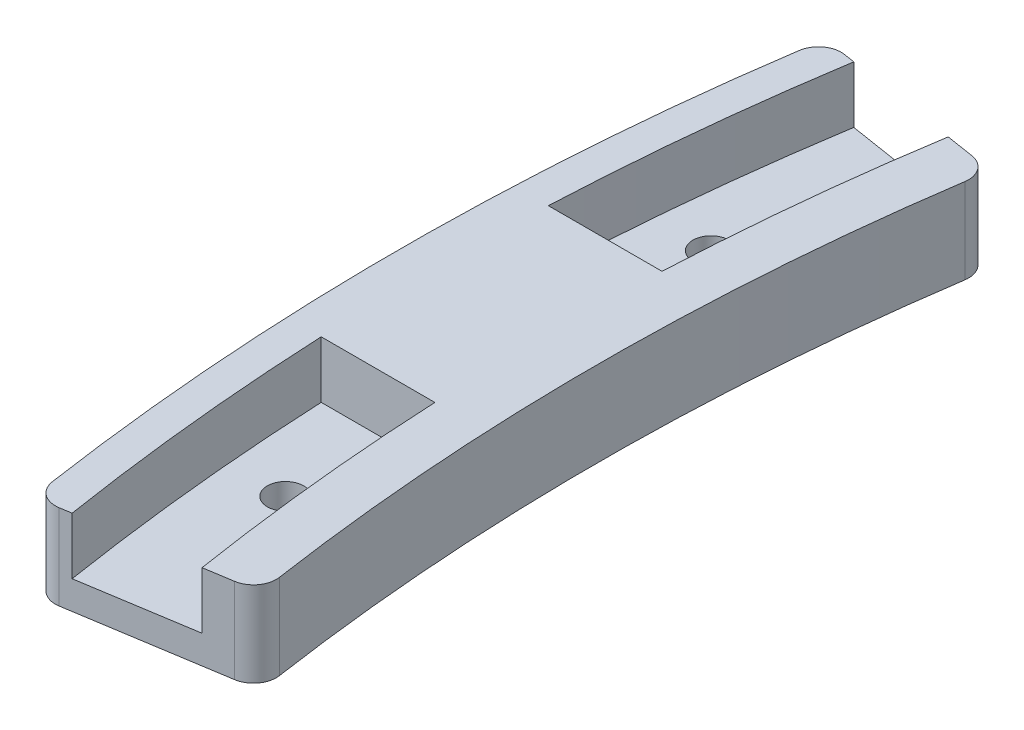
ISO-10303-21;
HEADER;
FILE_DESCRIPTION(('STEP AP214'),'2;1');
FILE_NAME('part.step','',(''),(''),'','','');
FILE_SCHEMA(('AUTOMOTIVE_DESIGN { 1 0 10303 214 1 1 1 1 }'));
ENDSEC;
DATA;
#1=APPLICATION_CONTEXT('core data for automotive mechanical design processes');
#2=APPLICATION_PROTOCOL_DEFINITION('international standard','automotive_design',2000,#1);
#3=PRODUCT_CONTEXT('',#1,'mechanical');
#4=PRODUCT('Part','Part','',(#3));
#5=PRODUCT_RELATED_PRODUCT_CATEGORY('part','',(#4));
#6=PRODUCT_DEFINITION_FORMATION('','',#4);
#7=PRODUCT_DEFINITION_CONTEXT('part definition',#1,'design');
#8=PRODUCT_DEFINITION('design','',#6,#7);
#9=PRODUCT_DEFINITION_SHAPE('','',#8);
#10=(LENGTH_UNIT() NAMED_UNIT(*) SI_UNIT(.MILLI.,.METRE.));
#11=(NAMED_UNIT(*) PLANE_ANGLE_UNIT() SI_UNIT($,.RADIAN.));
#12=(NAMED_UNIT(*) SI_UNIT($,.STERADIAN.) SOLID_ANGLE_UNIT());
#13=UNCERTAINTY_MEASURE_WITH_UNIT(LENGTH_MEASURE(1.E-05),#10,'distance_accuracy_value','');
#14=(GEOMETRIC_REPRESENTATION_CONTEXT(3) GLOBAL_UNCERTAINTY_ASSIGNED_CONTEXT((#13)) GLOBAL_UNIT_ASSIGNED_CONTEXT((#10,
#11,#12)) REPRESENTATION_CONTEXT('',''));
#15=CARTESIAN_POINT('',(0.,0.,0.));
#16=DIRECTION('',(0.,0.,1.));
#17=DIRECTION('',(1.,0.,0.));
#18=AXIS2_PLACEMENT_3D('',#15,#16,#17);
#19=CARTESIAN_POINT('',(0.,10.,0.));
#20=DIRECTION('',(0.156434465040234,0.,0.987688340595137));
#21=DIRECTION('',(0.987688340595137,0.,-0.156434465040234));
#22=AXIS2_PLACEMENT_3D('',#19,#20,#21);
#23=PLANE('',#22);
#24=DIRECTION('',(0.,1.,0.));
#25=VECTOR('',#24,1.);
#26=CARTESIAN_POINT('',(-218.270184732485,0.,34.5706010483885));
#27=LINE('',#26,#25);
#28=CARTESIAN_POINT('',(-218.270184732485,10.,34.5706010483885));
#29=VERTEX_POINT('',#28);
#30=CARTESIAN_POINT('',(-218.270184732485,2.5,34.5706010483885));
#31=VERTEX_POINT('',#30);
#32=EDGE_CURVE('E11',#29,#31,#27,.F.);
#33=ORIENTED_EDGE('',*,*,#32,.T.);
#34=DIRECTION('',(-0.987688340595137,0.,0.156434465040233));
#35=VECTOR('',#34,1.);
#36=CARTESIAN_POINT('',(-204.935810564757,2.5,32.4586436587549));
#37=LINE('',#36,#35);
#38=CARTESIAN_POINT('',(-204.935810564757,2.5,32.4586436587549));
#39=VERTEX_POINT('',#38);
#40=EDGE_CURVE('E155',#39,#31,#37,.T.);
#41=ORIENTED_EDGE('',*,*,#40,.F.);
#42=DIRECTION('',(0.,-1.,0.));
#43=VECTOR('',#42,1.);
#44=CARTESIAN_POINT('',(-204.935810564757,10.,32.4586436587549));
#45=LINE('',#44,#43);
#46=CARTESIAN_POINT('',(-204.935810564757,10.,32.4586436587549));
#47=VERTEX_POINT('',#46);
#48=EDGE_CURVE('E43',#39,#47,#45,.F.);
#49=ORIENTED_EDGE('',*,*,#48,.T.);
#50=DIRECTION('',(-0.987688340595137,0.,0.156434465040234));
#51=VECTOR('',#50,1.);
#52=CARTESIAN_POINT('',(0.,10.,0.));
#53=LINE('',#52,#51);
#54=CARTESIAN_POINT('',(-207.414551524979,10.,32.8512376584491));
#55=VERTEX_POINT('',#54);
#56=EDGE_CURVE('E200',#47,#55,#53,.T.);
#57=ORIENTED_EDGE('',*,*,#56,.T.);
#58=DIRECTION('',(0.,1.,0.));
#59=VECTOR('',#58,1.);
#60=CARTESIAN_POINT('',(-207.414551524979,5.,32.8512376584491));
#61=LINE('',#60,#59);
#62=CARTESIAN_POINT('',(-207.414551524979,5.,32.8512376584491));
#63=VERTEX_POINT('',#62);
#64=EDGE_CURVE('E288',#63,#55,#61,.T.);
#65=ORIENTED_EDGE('',*,*,#64,.F.);
#66=DIRECTION('',(0.987688340595137,0.,-0.156434465040234));
#67=VECTOR('',#66,1.);
#68=CARTESIAN_POINT('',(0.,5.,0.));
#69=LINE('',#68,#67);
#70=CARTESIAN_POINT('',(-217.29143493093,5.,34.4155823088514));
#71=VERTEX_POINT('',#70);
#72=EDGE_CURVE('E279',#71,#63,#69,.T.);
#73=ORIENTED_EDGE('',*,*,#72,.F.);
#74=DIRECTION('',(0.,1.,0.));
#75=VECTOR('',#74,1.);
#76=CARTESIAN_POINT('',(-217.29143493093,5.,34.4155823088514));
#77=LINE('',#76,#75);
#78=CARTESIAN_POINT('',(-217.29143493093,10.,34.4155823088514));
#79=VERTEX_POINT('',#78);
#80=EDGE_CURVE('E290',#71,#79,#77,.T.);
#81=ORIENTED_EDGE('',*,*,#80,.T.);
#82=EDGE_CURVE('E210',#79,#29,#53,.T.);
#83=ORIENTED_EDGE('',*,*,#82,.T.);
#84=EDGE_LOOP('',(#33,#41,#49,#57,#65,#73,#81,#83));
#85=FACE_BOUND('',#84,.T.);
#86=ADVANCED_FACE('F35',(#85),#23,.T.);
#87=CARTESIAN_POINT('',(0.,10.,0.));
#88=DIRECTION('',(0.156434465040234,0.,-0.987688340595137));
#89=DIRECTION('',(-0.987688340595137,0.,-0.156434465040234));
#90=AXIS2_PLACEMENT_3D('',#87,#88,#89);
#91=PLANE('',#90);
#92=DIRECTION('',(0.,-1.,0.));
#93=VECTOR('',#92,1.);
#94=CARTESIAN_POINT('',(-204.935810564757,10.,-32.4586436587549));
#95=LINE('',#94,#93);
#96=CARTESIAN_POINT('',(-204.935810564757,10.,-32.4586436587549));
#97=VERTEX_POINT('',#96);
#98=CARTESIAN_POINT('',(-204.935810564757,2.5,-32.4586436587549));
#99=VERTEX_POINT('',#98);
#100=EDGE_CURVE('E175',#97,#99,#95,.T.);
#101=ORIENTED_EDGE('',*,*,#100,.T.);
#102=DIRECTION('',(0.987688340595137,0.,0.156434465040233));
#103=VECTOR('',#102,1.);
#104=CARTESIAN_POINT('',(-218.270184732485,2.5,-34.5706010483885));
#105=LINE('',#104,#103);
#106=CARTESIAN_POINT('',(-218.270184732485,2.5,-34.5706010483884));
#107=VERTEX_POINT('',#106);
#108=EDGE_CURVE('E500',#107,#99,#105,.T.);
#109=ORIENTED_EDGE('',*,*,#108,.F.);
#110=DIRECTION('',(0.,1.,0.));
#111=VECTOR('',#110,1.);
#112=CARTESIAN_POINT('',(-218.270184732485,10.,-34.5706010483885));
#113=LINE('',#112,#111);
#114=CARTESIAN_POINT('',(-218.270184732485,10.,-34.5706010483885));
#115=VERTEX_POINT('',#114);
#116=EDGE_CURVE('E185',#107,#115,#113,.T.);
#117=ORIENTED_EDGE('',*,*,#116,.T.);
#118=DIRECTION('',(0.987688340595137,0.,0.156434465040234));
#119=VECTOR('',#118,1.);
#120=CARTESIAN_POINT('',(0.,10.,0.));
#121=LINE('',#120,#119);
#122=CARTESIAN_POINT('',(-217.29143493093,10.,-34.4155823088514));
#123=VERTEX_POINT('',#122);
#124=EDGE_CURVE('E177',#115,#123,#121,.T.);
#125=ORIENTED_EDGE('',*,*,#124,.T.);
#126=DIRECTION('',(0.,1.,0.));
#127=VECTOR('',#126,1.);
#128=CARTESIAN_POINT('',(-217.291434930931,5.,-34.4155823088515));
#129=LINE('',#128,#127);
#130=CARTESIAN_POINT('',(-217.291434930931,5.,-34.4155823088515));
#131=VERTEX_POINT('',#130);
#132=EDGE_CURVE('E254',#131,#123,#129,.T.);
#133=ORIENTED_EDGE('',*,*,#132,.F.);
#134=DIRECTION('',(-0.987688340595137,0.,-0.156434465040234));
#135=VECTOR('',#134,1.);
#136=CARTESIAN_POINT('',(0.,5.,0.));
#137=LINE('',#136,#135);
#138=CARTESIAN_POINT('',(-207.414551524979,5.,-32.8512376584492));
#139=VERTEX_POINT('',#138);
#140=EDGE_CURVE('E243',#139,#131,#137,.T.);
#141=ORIENTED_EDGE('',*,*,#140,.F.);
#142=DIRECTION('',(0.,1.,0.));
#143=VECTOR('',#142,1.);
#144=CARTESIAN_POINT('',(-207.414551524979,5.,-32.8512376584492));
#145=LINE('',#144,#143);
#146=CARTESIAN_POINT('',(-207.414551524979,10.,-32.8512376584492));
#147=VERTEX_POINT('',#146);
#148=EDGE_CURVE('E264',#139,#147,#145,.T.);
#149=ORIENTED_EDGE('',*,*,#148,.T.);
#150=EDGE_CURVE('E218',#147,#97,#121,.T.);
#151=ORIENTED_EDGE('',*,*,#150,.T.);
#152=EDGE_LOOP('',(#101,#109,#117,#125,#133,#141,#149,#151));
#153=FACE_BOUND('',#152,.T.);
#154=ADVANCED_FACE('F318',(#153),#91,.T.);
#155=CARTESIAN_POINT('',(0.,10.,0.));
#156=DIRECTION('',(0.,-1.,0.));
#157=DIRECTION('',(0.,0.,-1.));
#158=AXIS2_PLACEMENT_3D('',#155,#156,#157);
#159=CYLINDRICAL_SURFACE('',#158,205.5);
#160=DIRECTION('',(0.,-1.,0.));
#161=VECTOR('',#160,1.);
#162=CARTESIAN_POINT('',(-203.270378969586,10.,30.1894523560941));
#163=LINE('',#162,#161);
#164=CARTESIAN_POINT('',(-203.270378969586,10.,30.1894523560941));
#165=VERTEX_POINT('',#164);
#166=CARTESIAN_POINT('',(-203.270378969586,2.5,30.1894523560941));
#167=VERTEX_POINT('',#166);
#168=EDGE_CURVE('E193',#165,#167,#163,.T.);
#169=ORIENTED_EDGE('',*,*,#168,.T.);
#170=CARTESIAN_POINT('',(0.,2.5,0.));
#171=DIRECTION('',(0.,1.,0.));
#172=DIRECTION('',(0.,0.,-1.));
#173=AXIS2_PLACEMENT_3D('',#170,#171,#172);
#174=CIRCLE('',#173,205.5);
#175=CARTESIAN_POINT('',(-203.270378969586,2.5,-30.1894523560941));
#176=VERTEX_POINT('',#175);
#177=EDGE_CURVE('E50',#176,#167,#174,.T.);
#178=ORIENTED_EDGE('',*,*,#177,.F.);
#179=DIRECTION('',(0.,-1.,0.));
#180=VECTOR('',#179,1.);
#181=CARTESIAN_POINT('',(-203.270378969586,10.,-30.1894523560941));
#182=LINE('',#181,#180);
#183=CARTESIAN_POINT('',(-203.270378969586,10.,-30.1894523560941));
#184=VERTEX_POINT('',#183);
#185=EDGE_CURVE('E196',#176,#184,#182,.F.);
#186=ORIENTED_EDGE('',*,*,#185,.T.);
#187=CARTESIAN_POINT('',(0.,10.,0.));
#188=DIRECTION('',(0.,1.,0.));
#189=DIRECTION('',(0.,0.,1.));
#190=AXIS2_PLACEMENT_3D('',#187,#188,#189);
#191=CIRCLE('',#190,205.5);
#192=EDGE_CURVE('E209',#184,#165,#191,.T.);
#193=ORIENTED_EDGE('',*,*,#192,.T.);
#194=EDGE_LOOP('',(#169,#178,#186,#193));
#195=FACE_BOUND('',#194,.T.);
#196=ADVANCED_FACE('F215',(#195),#159,.F.);
#197=CARTESIAN_POINT('',(0.,10.,0.));
#198=DIRECTION('',(0.,-1.,0.));
#199=DIRECTION('',(0.,0.,-1.));
#200=AXIS2_PLACEMENT_3D('',#197,#198,#199);
#201=CYLINDRICAL_SURFACE('',#200,223.);
#202=CARTESIAN_POINT('',(0.,2.5,0.));
#203=DIRECTION('',(0.,-1.,0.));
#204=DIRECTION('',(0.,0.,-1.));
#205=AXIS2_PLACEMENT_3D('',#202,#203,#204);
#206=CIRCLE('',#205,223.);
#207=CARTESIAN_POINT('',(-220.561180845032,2.5,32.8902037732363));
#208=VERTEX_POINT('',#207);
#209=CARTESIAN_POINT('',(-220.561180845032,2.5,-32.890203773236));
#210=VERTEX_POINT('',#209);
#211=EDGE_CURVE('E152',#208,#210,#206,.T.);
#212=ORIENTED_EDGE('',*,*,#211,.F.);
#213=DIRECTION('',(0.,-1.,0.));
#214=VECTOR('',#213,1.);
#215=CARTESIAN_POINT('',(-220.561180845032,10.,32.8902037732362));
#216=LINE('',#215,#214);
#217=CARTESIAN_POINT('',(-220.561180845032,10.,32.8902037732362));
#218=VERTEX_POINT('',#217);
#219=EDGE_CURVE('E164',#208,#218,#216,.F.);
#220=ORIENTED_EDGE('',*,*,#219,.T.);
#221=CARTESIAN_POINT('',(0.,10.,0.));
#222=DIRECTION('',(0.,1.,0.));
#223=DIRECTION('',(0.,0.,1.));
#224=AXIS2_PLACEMENT_3D('',#221,#222,#223);
#225=CIRCLE('',#224,223.);
#226=CARTESIAN_POINT('',(-220.561180845032,10.,-32.8902037732362));
#227=VERTEX_POINT('',#226);
#228=EDGE_CURVE('E173',#227,#218,#225,.T.);
#229=ORIENTED_EDGE('',*,*,#228,.F.);
#230=DIRECTION('',(0.,-1.,0.));
#231=VECTOR('',#230,1.);
#232=CARTESIAN_POINT('',(-220.561180845032,10.,-32.8902037732362));
#233=LINE('',#232,#231);
#234=EDGE_CURVE('E167',#227,#210,#233,.T.);
#235=ORIENTED_EDGE('',*,*,#234,.T.);
#236=EDGE_LOOP('',(#212,#220,#229,#235));
#237=FACE_BOUND('',#236,.T.);
#238=ADVANCED_FACE('F162',(#237),#201,.T.);
#239=CARTESIAN_POINT('',(-214.181860089725,0.,-18.7384846907465));
#240=DIRECTION('',(0.,-1.,0.));
#241=DIRECTION('',(0.,0.,-1.));
#242=AXIS2_PLACEMENT_3D('',#239,#240,#241);
#243=CYLINDRICAL_SURFACE('',#242,1.59999999999999);
#244=CARTESIAN_POINT('',(-214.181860089725,5.,-18.7384846907465));
#245=DIRECTION('',(0.,1.,0.));
#246=DIRECTION('',(0.,0.,1.));
#247=AXIS2_PLACEMENT_3D('',#244,#245,#246);
#248=CIRCLE('',#247,1.59999999999999);
#249=CARTESIAN_POINT('',(-214.181860089725,5.,-17.1384846907465));
#250=VERTEX_POINT('',#249);
#251=EDGE_CURVE('E223',#250,#250,#248,.T.);
#252=ORIENTED_EDGE('',*,*,#251,.T.);
#253=EDGE_LOOP('',(#252));
#254=FACE_BOUND('',#253,.T.);
#255=CARTESIAN_POINT('',(-214.181860089725,2.5,-18.7384846907465));
#256=DIRECTION('',(0.,-1.,0.));
#257=DIRECTION('',(0.,0.,-1.));
#258=AXIS2_PLACEMENT_3D('',#255,#256,#257);
#259=CIRCLE('',#258,1.59999999999999);
#260=CARTESIAN_POINT('',(-214.181860089725,2.5,-20.3384846907465));
#261=VERTEX_POINT('',#260);
#262=EDGE_CURVE('E231',#261,#261,#259,.F.);
#263=ORIENTED_EDGE('',*,*,#262,.F.);
#264=EDGE_LOOP('',(#263));
#265=FACE_BOUND('',#264,.T.);
#266=ADVANCED_FACE('F347',(#254,#265),#243,.F.);
#267=CARTESIAN_POINT('',(-214.181860089725,0.,18.7384846907466));
#268=DIRECTION('',(0.,-1.,0.));
#269=DIRECTION('',(0.,0.,-1.));
#270=AXIS2_PLACEMENT_3D('',#267,#268,#269);
#271=CYLINDRICAL_SURFACE('',#270,1.59999999999999);
#272=CARTESIAN_POINT('',(-214.181860089725,5.,18.7384846907466));
#273=DIRECTION('',(0.,1.,0.));
#274=DIRECTION('',(0.,0.,1.));
#275=AXIS2_PLACEMENT_3D('',#272,#273,#274);
#276=CIRCLE('',#275,1.59999999999999);
#277=CARTESIAN_POINT('',(-214.181860089725,5.,20.3384846907466));
#278=VERTEX_POINT('',#277);
#279=EDGE_CURVE('E180',#278,#278,#276,.T.);
#280=ORIENTED_EDGE('',*,*,#279,.T.);
#281=EDGE_LOOP('',(#280));
#282=FACE_BOUND('',#281,.T.);
#283=CARTESIAN_POINT('',(-214.181860089725,2.5,18.7384846907466));
#284=DIRECTION('',(0.,-1.,0.));
#285=DIRECTION('',(0.,0.,-1.));
#286=AXIS2_PLACEMENT_3D('',#283,#284,#285);
#287=CIRCLE('',#286,1.59999999999999);
#288=CARTESIAN_POINT('',(-214.181860089725,2.5,17.1384846907466));
#289=VERTEX_POINT('',#288);
#290=EDGE_CURVE('E235',#289,#289,#287,.F.);
#291=ORIENTED_EDGE('',*,*,#290,.F.);
#292=EDGE_LOOP('',(#291));
#293=FACE_BOUND('',#292,.T.);
#294=ADVANCED_FACE('F331',(#282,#293),#271,.F.);
#295=CARTESIAN_POINT('',(-218.583053662566,10.,-32.5952243671982));
#296=DIRECTION('',(0.,-1.,0.));
#297=DIRECTION('',(0.,0.,-1.));
#298=AXIS2_PLACEMENT_3D('',#295,#296,#297);
#299=CYLINDRICAL_SURFACE('',#298,2.);
#300=ORIENTED_EDGE('',*,*,#116,.F.);
#301=CARTESIAN_POINT('',(-218.583053662566,2.5,-32.5952243671982));
#302=DIRECTION('',(0.,-1.,0.));
#303=DIRECTION('',(0.,0.,-1.));
#304=AXIS2_PLACEMENT_3D('',#301,#302,#303);
#305=CIRCLE('',#304,1.99999999999997);
#306=EDGE_CURVE('E168',#210,#107,#305,.T.);
#307=ORIENTED_EDGE('',*,*,#306,.F.);
#308=ORIENTED_EDGE('',*,*,#234,.F.);
#309=CARTESIAN_POINT('',(-218.583053662566,10.,-32.5952243671982));
#310=DIRECTION('',(0.,1.,0.));
#311=DIRECTION('',(0.,0.,1.));
#312=AXIS2_PLACEMENT_3D('',#309,#310,#311);
#313=CIRCLE('',#312,2.);
#314=EDGE_CURVE('E191',#115,#227,#313,.T.);
#315=ORIENTED_EDGE('',*,*,#314,.F.);
#316=EDGE_LOOP('',(#300,#307,#308,#315));
#317=FACE_BOUND('',#316,.T.);
#318=ADVANCED_FACE('F327',(#317),#299,.T.);
#319=CARTESIAN_POINT('',(-205.248679494837,10.,-30.4832669775646));
#320=DIRECTION('',(0.,-1.,0.));
#321=DIRECTION('',(0.,0.,-1.));
#322=AXIS2_PLACEMENT_3D('',#319,#320,#321);
#323=CYLINDRICAL_SURFACE('',#322,2.);
#324=ORIENTED_EDGE('',*,*,#185,.F.);
#325=CARTESIAN_POINT('',(-205.248679494837,2.5,-30.4832669775646));
#326=DIRECTION('',(0.,-1.,0.));
#327=DIRECTION('',(0.,0.,-1.));
#328=AXIS2_PLACEMENT_3D('',#325,#326,#327);
#329=CIRCLE('',#328,2.00000000000001);
#330=EDGE_CURVE('E498',#99,#176,#329,.T.);
#331=ORIENTED_EDGE('',*,*,#330,.F.);
#332=ORIENTED_EDGE('',*,*,#100,.F.);
#333=CARTESIAN_POINT('',(-205.248679494837,10.,-30.4832669775646));
#334=DIRECTION('',(0.,1.,0.));
#335=DIRECTION('',(0.,0.,1.));
#336=AXIS2_PLACEMENT_3D('',#333,#334,#335);
#337=CIRCLE('',#336,2.);
#338=EDGE_CURVE('E189',#184,#97,#337,.T.);
#339=ORIENTED_EDGE('',*,*,#338,.F.);
#340=EDGE_LOOP('',(#324,#331,#332,#339));
#341=FACE_BOUND('',#340,.T.);
#342=ADVANCED_FACE('F330',(#341),#323,.T.);
#343=CARTESIAN_POINT('',(-218.583053662566,10.,32.5952243671982));
#344=DIRECTION('',(0.,-1.,0.));
#345=DIRECTION('',(0.,0.,-1.));
#346=AXIS2_PLACEMENT_3D('',#343,#344,#345);
#347=CYLINDRICAL_SURFACE('',#346,2.);
#348=ORIENTED_EDGE('',*,*,#219,.F.);
#349=CARTESIAN_POINT('',(-218.583053662566,2.5,32.5952243671982));
#350=DIRECTION('',(0.,-1.,0.));
#351=DIRECTION('',(0.,0.,-1.));
#352=AXIS2_PLACEMENT_3D('',#349,#350,#351);
#353=CIRCLE('',#352,1.99999999999998);
#354=EDGE_CURVE('E148',#31,#208,#353,.T.);
#355=ORIENTED_EDGE('',*,*,#354,.F.);
#356=ORIENTED_EDGE('',*,*,#32,.F.);
#357=CARTESIAN_POINT('',(-218.583053662566,10.,32.5952243671982));
#358=DIRECTION('',(0.,1.,0.));
#359=DIRECTION('',(0.,0.,1.));
#360=AXIS2_PLACEMENT_3D('',#357,#358,#359);
#361=CIRCLE('',#360,2.);
#362=EDGE_CURVE('E172',#218,#29,#361,.T.);
#363=ORIENTED_EDGE('',*,*,#362,.F.);
#364=EDGE_LOOP('',(#348,#355,#356,#363));
#365=FACE_BOUND('',#364,.T.);
#366=ADVANCED_FACE('F171',(#365),#347,.T.);
#367=CARTESIAN_POINT('',(-205.248679494837,10.,30.4832669775646));
#368=DIRECTION('',(0.,-1.,0.));
#369=DIRECTION('',(0.,0.,-1.));
#370=AXIS2_PLACEMENT_3D('',#367,#368,#369);
#371=CYLINDRICAL_SURFACE('',#370,2.);
#372=ORIENTED_EDGE('',*,*,#48,.F.);
#373=CARTESIAN_POINT('',(-205.248679494837,2.5,30.4832669775646));
#374=DIRECTION('',(0.,-1.,0.));
#375=DIRECTION('',(0.,0.,-1.));
#376=AXIS2_PLACEMENT_3D('',#373,#374,#375);
#377=CIRCLE('',#376,2.00000000000002);
#378=EDGE_CURVE('E213',#167,#39,#377,.T.);
#379=ORIENTED_EDGE('',*,*,#378,.F.);
#380=ORIENTED_EDGE('',*,*,#168,.F.);
#381=CARTESIAN_POINT('',(-205.248679494837,10.,30.4832669775646));
#382=DIRECTION('',(0.,1.,0.));
#383=DIRECTION('',(0.,0.,1.));
#384=AXIS2_PLACEMENT_3D('',#381,#382,#383);
#385=CIRCLE('',#384,2.);
#386=EDGE_CURVE('E58',#47,#165,#385,.T.);
#387=ORIENTED_EDGE('',*,*,#386,.F.);
#388=EDGE_LOOP('',(#372,#379,#380,#387));
#389=FACE_BOUND('',#388,.T.);
#390=ADVANCED_FACE('F37',(#389),#371,.T.);
#391=CARTESIAN_POINT('',(0.,10.,0.));
#392=DIRECTION('',(0.,1.,0.));
#393=DIRECTION('',(0.,0.,1.));
#394=AXIS2_PLACEMENT_3D('',#391,#392,#393);
#395=PLANE('',#394);
#396=ORIENTED_EDGE('',*,*,#124,.F.);
#397=ORIENTED_EDGE('',*,*,#314,.T.);
#398=ORIENTED_EDGE('',*,*,#228,.T.);
#399=ORIENTED_EDGE('',*,*,#362,.T.);
#400=ORIENTED_EDGE('',*,*,#82,.F.);
#401=CARTESIAN_POINT('',(0.,10.,0.));
#402=DIRECTION('',(0.,1.,0.));
#403=DIRECTION('',(0.,0.,1.));
#404=AXIS2_PLACEMENT_3D('',#401,#402,#403);
#405=CIRCLE('',#404,220.);
#406=CARTESIAN_POINT('',(-219.772609758359,10.,10.));
#407=VERTEX_POINT('',#406);
#408=EDGE_CURVE('E228',#407,#79,#405,.T.);
#409=ORIENTED_EDGE('',*,*,#408,.F.);
#410=DIRECTION('',(-1.,0.,0.));
#411=VECTOR('',#410,1.);
#412=CARTESIAN_POINT('',(0.,10.,10.));
#413=LINE('',#412,#411);
#414=CARTESIAN_POINT('',(-209.76176963403,10.,10.));
#415=VERTEX_POINT('',#414);
#416=EDGE_CURVE('E225',#415,#407,#413,.T.);
#417=ORIENTED_EDGE('',*,*,#416,.F.);
#418=CARTESIAN_POINT('',(0.,10.,0.));
#419=DIRECTION('',(0.,1.,0.));
#420=DIRECTION('',(0.,0.,1.));
#421=AXIS2_PLACEMENT_3D('',#418,#419,#420);
#422=CIRCLE('',#421,210.);
#423=EDGE_CURVE('E208',#415,#55,#422,.T.);
#424=ORIENTED_EDGE('',*,*,#423,.T.);
#425=ORIENTED_EDGE('',*,*,#56,.F.);
#426=ORIENTED_EDGE('',*,*,#386,.T.);
#427=ORIENTED_EDGE('',*,*,#192,.F.);
#428=ORIENTED_EDGE('',*,*,#338,.T.);
#429=ORIENTED_EDGE('',*,*,#150,.F.);
#430=CARTESIAN_POINT('',(0.,10.,0.));
#431=DIRECTION('',(0.,1.,0.));
#432=DIRECTION('',(0.,0.,1.));
#433=AXIS2_PLACEMENT_3D('',#430,#431,#432);
#434=CIRCLE('',#433,210.);
#435=CARTESIAN_POINT('',(-209.76176963403,10.,-9.99999999999997));
#436=VERTEX_POINT('',#435);
#437=EDGE_CURVE('E247',#147,#436,#434,.T.);
#438=ORIENTED_EDGE('',*,*,#437,.T.);
#439=DIRECTION('',(-1.,0.,0.));
#440=VECTOR('',#439,1.);
#441=CARTESIAN_POINT('',(0.,10.,-9.99999999999997));
#442=LINE('',#441,#440);
#443=CARTESIAN_POINT('',(-219.772609758359,10.,-9.99999999999997));
#444=VERTEX_POINT('',#443);
#445=EDGE_CURVE('E258',#436,#444,#442,.T.);
#446=ORIENTED_EDGE('',*,*,#445,.T.);
#447=CARTESIAN_POINT('',(0.,10.,0.));
#448=DIRECTION('',(0.,1.,0.));
#449=DIRECTION('',(0.,0.,1.));
#450=AXIS2_PLACEMENT_3D('',#447,#448,#449);
#451=CIRCLE('',#450,220.);
#452=EDGE_CURVE('E255',#123,#444,#451,.T.);
#453=ORIENTED_EDGE('',*,*,#452,.F.);
#454=EDGE_LOOP('',(#396,#397,#398,#399,#400,#409,#417,#424,#425,#426,#427,#428,#429,#438,#446,#453));
#455=FACE_BOUND('',#454,.T.);
#456=ADVANCED_FACE('F205',(#455),#395,.T.);
#457=CARTESIAN_POINT('',(0.,5.,10.));
#458=DIRECTION('',(0.,0.,-1.));
#459=DIRECTION('',(-1.,0.,0.));
#460=AXIS2_PLACEMENT_3D('',#457,#458,#459);
#461=PLANE('',#460);
#462=ORIENTED_EDGE('',*,*,#416,.T.);
#463=DIRECTION('',(0.,1.,0.));
#464=VECTOR('',#463,1.);
#465=CARTESIAN_POINT('',(-219.772609758359,5.,10.));
#466=LINE('',#465,#464);
#467=CARTESIAN_POINT('',(-219.772609758359,5.,10.));
#468=VERTEX_POINT('',#467);
#469=EDGE_CURVE('E283',#468,#407,#466,.T.);
#470=ORIENTED_EDGE('',*,*,#469,.F.);
#471=DIRECTION('',(-1.,0.,0.));
#472=VECTOR('',#471,1.);
#473=CARTESIAN_POINT('',(0.,5.,10.));
#474=LINE('',#473,#472);
#475=CARTESIAN_POINT('',(-209.76176963403,5.,10.));
#476=VERTEX_POINT('',#475);
#477=EDGE_CURVE('E273',#476,#468,#474,.T.);
#478=ORIENTED_EDGE('',*,*,#477,.F.);
#479=DIRECTION('',(0.,1.,0.));
#480=VECTOR('',#479,1.);
#481=CARTESIAN_POINT('',(-209.76176963403,5.,10.));
#482=LINE('',#481,#480);
#483=EDGE_CURVE('E259',#476,#415,#482,.T.);
#484=ORIENTED_EDGE('',*,*,#483,.T.);
#485=EDGE_LOOP('',(#462,#470,#478,#484));
#486=FACE_BOUND('',#485,.T.);
#487=ADVANCED_FACE('F305',(#486),#461,.F.);
#488=CARTESIAN_POINT('',(0.,5.,0.));
#489=DIRECTION('',(0.,1.,0.));
#490=DIRECTION('',(0.,0.,1.));
#491=AXIS2_PLACEMENT_3D('',#488,#489,#490);
#492=CYLINDRICAL_SURFACE('',#491,210.);
#493=ORIENTED_EDGE('',*,*,#423,.F.);
#494=ORIENTED_EDGE('',*,*,#483,.F.);
#495=CARTESIAN_POINT('',(0.,5.,0.));
#496=DIRECTION('',(0.,1.,0.));
#497=DIRECTION('',(0.,0.,1.));
#498=AXIS2_PLACEMENT_3D('',#495,#496,#497);
#499=CIRCLE('',#498,210.);
#500=EDGE_CURVE('E282',#476,#63,#499,.T.);
#501=ORIENTED_EDGE('',*,*,#500,.T.);
#502=ORIENTED_EDGE('',*,*,#64,.T.);
#503=EDGE_LOOP('',(#493,#494,#501,#502));
#504=FACE_BOUND('',#503,.T.);
#505=ADVANCED_FACE('F307',(#504),#492,.T.);
#506=CARTESIAN_POINT('',(0.,5.,0.));
#507=DIRECTION('',(0.,1.,0.));
#508=DIRECTION('',(0.,0.,1.));
#509=AXIS2_PLACEMENT_3D('',#506,#507,#508);
#510=CYLINDRICAL_SURFACE('',#509,220.);
#511=ORIENTED_EDGE('',*,*,#408,.T.);
#512=ORIENTED_EDGE('',*,*,#80,.F.);
#513=CARTESIAN_POINT('',(0.,5.,0.));
#514=DIRECTION('',(0.,1.,0.));
#515=DIRECTION('',(0.,0.,1.));
#516=AXIS2_PLACEMENT_3D('',#513,#514,#515);
#517=CIRCLE('',#516,220.);
#518=EDGE_CURVE('E276',#468,#71,#517,.T.);
#519=ORIENTED_EDGE('',*,*,#518,.F.);
#520=ORIENTED_EDGE('',*,*,#469,.T.);
#521=EDGE_LOOP('',(#511,#512,#519,#520));
#522=FACE_BOUND('',#521,.T.);
#523=ADVANCED_FACE('F296',(#522),#510,.F.);
#524=CARTESIAN_POINT('',(0.,5.,0.));
#525=DIRECTION('',(0.,1.,0.));
#526=DIRECTION('',(0.,0.,1.));
#527=AXIS2_PLACEMENT_3D('',#524,#525,#526);
#528=PLANE('',#527);
#529=ORIENTED_EDGE('',*,*,#279,.F.);
#530=EDGE_LOOP('',(#529));
#531=FACE_BOUND('',#530,.T.);
#532=ORIENTED_EDGE('',*,*,#477,.T.);
#533=ORIENTED_EDGE('',*,*,#518,.T.);
#534=ORIENTED_EDGE('',*,*,#72,.T.);
#535=ORIENTED_EDGE('',*,*,#500,.F.);
#536=EDGE_LOOP('',(#532,#533,#534,#535));
#537=FACE_BOUND('',#536,.T.);
#538=ADVANCED_FACE('F303',(#531,#537),#528,.T.);
#539=CARTESIAN_POINT('',(0.,5.,0.));
#540=DIRECTION('',(0.,1.,0.));
#541=DIRECTION('',(0.,0.,1.));
#542=AXIS2_PLACEMENT_3D('',#539,#540,#541);
#543=CYLINDRICAL_SURFACE('',#542,210.);
#544=ORIENTED_EDGE('',*,*,#437,.F.);
#545=ORIENTED_EDGE('',*,*,#148,.F.);
#546=CARTESIAN_POINT('',(0.,5.,0.));
#547=DIRECTION('',(0.,1.,0.));
#548=DIRECTION('',(0.,0.,1.));
#549=AXIS2_PLACEMENT_3D('',#546,#547,#548);
#550=CIRCLE('',#549,210.);
#551=CARTESIAN_POINT('',(-209.76176963403,5.,-9.99999999999997));
#552=VERTEX_POINT('',#551);
#553=EDGE_CURVE('E252',#139,#552,#550,.T.);
#554=ORIENTED_EDGE('',*,*,#553,.T.);
#555=DIRECTION('',(0.,1.,0.));
#556=VECTOR('',#555,1.);
#557=CARTESIAN_POINT('',(-209.76176963403,5.,-9.99999999999997));
#558=LINE('',#557,#556);
#559=EDGE_CURVE('E267',#552,#436,#558,.T.);
#560=ORIENTED_EDGE('',*,*,#559,.T.);
#561=EDGE_LOOP('',(#544,#545,#554,#560));
#562=FACE_BOUND('',#561,.T.);
#563=ADVANCED_FACE('F396',(#562),#543,.T.);
#564=CARTESIAN_POINT('',(0.,5.,-9.99999999999997));
#565=DIRECTION('',(0.,0.,-1.));
#566=DIRECTION('',(-1.,0.,0.));
#567=AXIS2_PLACEMENT_3D('',#564,#565,#566);
#568=PLANE('',#567);
#569=ORIENTED_EDGE('',*,*,#445,.F.);
#570=ORIENTED_EDGE('',*,*,#559,.F.);
#571=DIRECTION('',(-1.,0.,0.));
#572=VECTOR('',#571,1.);
#573=CARTESIAN_POINT('',(0.,5.,-9.99999999999997));
#574=LINE('',#573,#572);
#575=CARTESIAN_POINT('',(-219.772609758359,5.,-9.99999999999997));
#576=VERTEX_POINT('',#575);
#577=EDGE_CURVE('E250',#552,#576,#574,.T.);
#578=ORIENTED_EDGE('',*,*,#577,.T.);
#579=DIRECTION('',(0.,1.,0.));
#580=VECTOR('',#579,1.);
#581=CARTESIAN_POINT('',(-219.772609758359,5.,-9.99999999999997));
#582=LINE('',#581,#580);
#583=EDGE_CURVE('E269',#576,#444,#582,.T.);
#584=ORIENTED_EDGE('',*,*,#583,.T.);
#585=EDGE_LOOP('',(#569,#570,#578,#584));
#586=FACE_BOUND('',#585,.T.);
#587=ADVANCED_FACE('F406',(#586),#568,.T.);
#588=CARTESIAN_POINT('',(0.,5.,0.));
#589=DIRECTION('',(0.,1.,0.));
#590=DIRECTION('',(0.,0.,1.));
#591=AXIS2_PLACEMENT_3D('',#588,#589,#590);
#592=CYLINDRICAL_SURFACE('',#591,220.);
#593=ORIENTED_EDGE('',*,*,#452,.T.);
#594=ORIENTED_EDGE('',*,*,#583,.F.);
#595=CARTESIAN_POINT('',(0.,5.,0.));
#596=DIRECTION('',(0.,1.,0.));
#597=DIRECTION('',(0.,0.,1.));
#598=AXIS2_PLACEMENT_3D('',#595,#596,#597);
#599=CIRCLE('',#598,220.);
#600=EDGE_CURVE('E246',#131,#576,#599,.T.);
#601=ORIENTED_EDGE('',*,*,#600,.F.);
#602=ORIENTED_EDGE('',*,*,#132,.T.);
#603=EDGE_LOOP('',(#593,#594,#601,#602));
#604=FACE_BOUND('',#603,.T.);
#605=ADVANCED_FACE('F382',(#604),#592,.F.);
#606=CARTESIAN_POINT('',(0.,5.,0.));
#607=DIRECTION('',(0.,1.,0.));
#608=DIRECTION('',(0.,0.,1.));
#609=AXIS2_PLACEMENT_3D('',#606,#607,#608);
#610=PLANE('',#609);
#611=ORIENTED_EDGE('',*,*,#251,.F.);
#612=EDGE_LOOP('',(#611));
#613=FACE_BOUND('',#612,.T.);
#614=ORIENTED_EDGE('',*,*,#140,.T.);
#615=ORIENTED_EDGE('',*,*,#600,.T.);
#616=ORIENTED_EDGE('',*,*,#577,.F.);
#617=ORIENTED_EDGE('',*,*,#553,.F.);
#618=EDGE_LOOP('',(#614,#615,#616,#617));
#619=FACE_BOUND('',#618,.T.);
#620=ADVANCED_FACE('F377',(#613,#619),#610,.T.);
#621=CARTESIAN_POINT('',(-218.583053662566,2.5,32.5952243671982));
#622=DIRECTION('',(0.,-1.,0.));
#623=DIRECTION('',(0.,0.,-1.));
#624=AXIS2_PLACEMENT_3D('',#621,#622,#623);
#625=PLANE('',#624);
#626=ORIENTED_EDGE('',*,*,#354,.T.);
#627=ORIENTED_EDGE('',*,*,#211,.T.);
#628=ORIENTED_EDGE('',*,*,#306,.T.);
#629=ORIENTED_EDGE('',*,*,#108,.T.);
#630=ORIENTED_EDGE('',*,*,#330,.T.);
#631=ORIENTED_EDGE('',*,*,#177,.T.);
#632=ORIENTED_EDGE('',*,*,#378,.T.);
#633=ORIENTED_EDGE('',*,*,#40,.T.);
#634=EDGE_LOOP('',(#626,#627,#628,#629,#630,#631,#632,#633));
#635=FACE_BOUND('',#634,.T.);
#636=ORIENTED_EDGE('',*,*,#290,.T.);
#637=EDGE_LOOP('',(#636));
#638=FACE_BOUND('',#637,.T.);
#639=ORIENTED_EDGE('',*,*,#262,.T.);
#640=EDGE_LOOP('',(#639));
#641=FACE_BOUND('',#640,.T.);
#642=ADVANCED_FACE('F150',(#635,#638,#641),#625,.T.);
#643=CLOSED_SHELL('',(#86,#154,#196,#238,#266,#294,#318,#342,#366,#390,#456,#487,#505,#523,#538,
#563,#587,#605,#620,#642));
#644=MANIFOLD_SOLID_BREP('B2',#643);
#645=ADVANCED_BREP_SHAPE_REPRESENTATION('',(#18,#644),#14);
#646=SHAPE_DEFINITION_REPRESENTATION(#9,#645);
ENDSEC;
END-ISO-10303-21;
